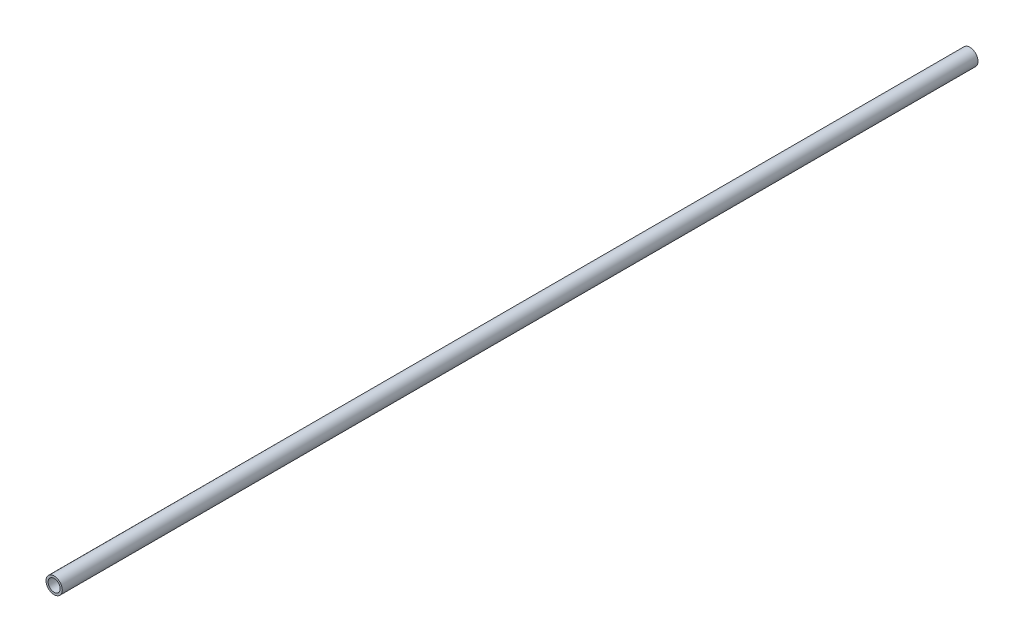
ISO-10303-21;
HEADER;
FILE_DESCRIPTION(('STEP AP214'),'2;1');
FILE_NAME('part.step','',(''),(''),'','','');
FILE_SCHEMA(('AUTOMOTIVE_DESIGN { 1 0 10303 214 1 1 1 1 }'));
ENDSEC;
DATA;
#1=APPLICATION_CONTEXT('core data for automotive mechanical design processes');
#2=APPLICATION_PROTOCOL_DEFINITION('international standard','automotive_design',2000,#1);
#3=PRODUCT_CONTEXT('',#1,'mechanical');
#4=PRODUCT('Part','Part','',(#3));
#5=PRODUCT_RELATED_PRODUCT_CATEGORY('part','',(#4));
#6=PRODUCT_DEFINITION_FORMATION('','',#4);
#7=PRODUCT_DEFINITION_CONTEXT('part definition',#1,'design');
#8=PRODUCT_DEFINITION('design','',#6,#7);
#9=PRODUCT_DEFINITION_SHAPE('','',#8);
#10=(LENGTH_UNIT() NAMED_UNIT(*) SI_UNIT(.MILLI.,.METRE.));
#11=(NAMED_UNIT(*) PLANE_ANGLE_UNIT() SI_UNIT($,.RADIAN.));
#12=(NAMED_UNIT(*) SI_UNIT($,.STERADIAN.) SOLID_ANGLE_UNIT());
#13=UNCERTAINTY_MEASURE_WITH_UNIT(LENGTH_MEASURE(1.E-05),#10,'distance_accuracy_value','');
#14=(GEOMETRIC_REPRESENTATION_CONTEXT(3) GLOBAL_UNCERTAINTY_ASSIGNED_CONTEXT((#13)) GLOBAL_UNIT_ASSIGNED_CONTEXT((#10,
#11,#12)) REPRESENTATION_CONTEXT('',''));
#15=CARTESIAN_POINT('',(0.,0.,0.));
#16=DIRECTION('',(0.,0.,1.));
#17=DIRECTION('',(1.,0.,0.));
#18=AXIS2_PLACEMENT_3D('',#15,#16,#17);
#19=CARTESIAN_POINT('',(0.,0.,600.));
#20=DIRECTION('',(0.,0.,1.));
#21=DIRECTION('',(1.,0.,0.));
#22=AXIS2_PLACEMENT_3D('',#19,#20,#21);
#23=PLANE('',#22);
#24=CARTESIAN_POINT('',(0.,0.,600.));
#25=DIRECTION('',(0.,0.,1.));
#26=DIRECTION('',(1.,0.,0.));
#27=AXIS2_PLACEMENT_3D('',#24,#25,#26);
#28=CIRCLE('',#27,10.668);
#29=CARTESIAN_POINT('',(10.668,0.,600.));
#30=VERTEX_POINT('',#29);
#31=EDGE_CURVE('E11',#30,#30,#28,.T.);
#32=ORIENTED_EDGE('',*,*,#31,.T.);
#33=EDGE_LOOP('',(#32));
#34=FACE_BOUND('',#33,.T.);
#35=CARTESIAN_POINT('',(0.,0.,600.));
#36=DIRECTION('',(0.,0.,1.));
#37=DIRECTION('',(1.,0.,0.));
#38=AXIS2_PLACEMENT_3D('',#35,#36,#37);
#39=CIRCLE('',#38,7.8994);
#40=CARTESIAN_POINT('',(7.8994,0.,600.));
#41=VERTEX_POINT('',#40);
#42=EDGE_CURVE('E50',#41,#41,#39,.T.);
#43=ORIENTED_EDGE('',*,*,#42,.F.);
#44=EDGE_LOOP('',(#43));
#45=FACE_BOUND('',#44,.T.);
#46=ADVANCED_FACE('F39',(#34,#45),#23,.T.);
#47=CARTESIAN_POINT('',(0.,0.,-600.));
#48=DIRECTION('',(0.,0.,1.));
#49=DIRECTION('',(1.,0.,0.));
#50=AXIS2_PLACEMENT_3D('',#47,#48,#49);
#51=PLANE('',#50);
#52=CARTESIAN_POINT('',(0.,0.,-600.));
#53=DIRECTION('',(0.,0.,1.));
#54=DIRECTION('',(1.,0.,0.));
#55=AXIS2_PLACEMENT_3D('',#52,#53,#54);
#56=CIRCLE('',#55,10.668);
#57=CARTESIAN_POINT('',(10.668,0.,-600.));
#58=VERTEX_POINT('',#57);
#59=EDGE_CURVE('E43',#58,#58,#56,.T.);
#60=ORIENTED_EDGE('',*,*,#59,.F.);
#61=EDGE_LOOP('',(#60));
#62=FACE_BOUND('',#61,.T.);
#63=CARTESIAN_POINT('',(0.,0.,-600.));
#64=DIRECTION('',(0.,0.,1.));
#65=DIRECTION('',(1.,0.,0.));
#66=AXIS2_PLACEMENT_3D('',#63,#64,#65);
#67=CIRCLE('',#66,7.8994);
#68=CARTESIAN_POINT('',(7.8994,0.,-600.));
#69=VERTEX_POINT('',#68);
#70=EDGE_CURVE('E52',#69,#69,#67,.T.);
#71=ORIENTED_EDGE('',*,*,#70,.T.);
#72=EDGE_LOOP('',(#71));
#73=FACE_BOUND('',#72,.T.);
#74=ADVANCED_FACE('F62',(#62,#73),#51,.F.);
#75=CARTESIAN_POINT('',(0.,0.,600.));
#76=DIRECTION('',(0.,0.,-1.));
#77=DIRECTION('',(-1.,0.,0.));
#78=AXIS2_PLACEMENT_3D('',#75,#76,#77);
#79=CYLINDRICAL_SURFACE('',#78,10.668);
#80=ORIENTED_EDGE('',*,*,#31,.F.);
#81=EDGE_LOOP('',(#80));
#82=FACE_BOUND('',#81,.T.);
#83=ORIENTED_EDGE('',*,*,#59,.T.);
#84=EDGE_LOOP('',(#83));
#85=FACE_BOUND('',#84,.T.);
#86=ADVANCED_FACE('F41',(#82,#85),#79,.T.);
#87=CARTESIAN_POINT('',(0.,0.,600.));
#88=DIRECTION('',(0.,0.,-1.));
#89=DIRECTION('',(-1.,0.,0.));
#90=AXIS2_PLACEMENT_3D('',#87,#88,#89);
#91=CYLINDRICAL_SURFACE('',#90,7.8994);
#92=ORIENTED_EDGE('',*,*,#42,.T.);
#93=EDGE_LOOP('',(#92));
#94=FACE_BOUND('',#93,.T.);
#95=ORIENTED_EDGE('',*,*,#70,.F.);
#96=EDGE_LOOP('',(#95));
#97=FACE_BOUND('',#96,.T.);
#98=ADVANCED_FACE('F58',(#94,#97),#91,.F.);
#99=CLOSED_SHELL('',(#46,#74,#86,#98));
#100=MANIFOLD_SOLID_BREP('B2',#99);
#101=ADVANCED_BREP_SHAPE_REPRESENTATION('',(#18,#100),#14);
#102=SHAPE_DEFINITION_REPRESENTATION(#9,#101);
ENDSEC;
END-ISO-10303-21;
